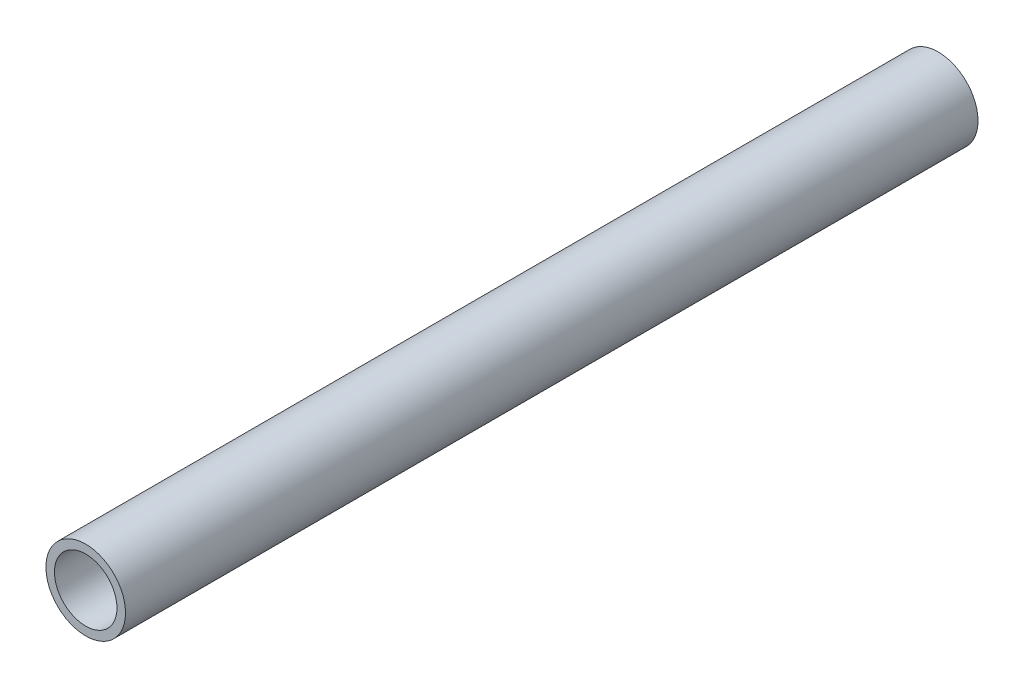
ISO-10303-21;
HEADER;
FILE_DESCRIPTION(('STEP AP214'),'2;1');
FILE_NAME('part.step','',(''),(''),'','','');
FILE_SCHEMA(('AUTOMOTIVE_DESIGN { 1 0 10303 214 1 1 1 1 }'));
ENDSEC;
DATA;
#1=APPLICATION_CONTEXT('core data for automotive mechanical design processes');
#2=APPLICATION_PROTOCOL_DEFINITION('international standard','automotive_design',2000,#1);
#3=PRODUCT_CONTEXT('',#1,'mechanical');
#4=PRODUCT('Part','Part','',(#3));
#5=PRODUCT_RELATED_PRODUCT_CATEGORY('part','',(#4));
#6=PRODUCT_DEFINITION_FORMATION('','',#4);
#7=PRODUCT_DEFINITION_CONTEXT('part definition',#1,'design');
#8=PRODUCT_DEFINITION('design','',#6,#7);
#9=PRODUCT_DEFINITION_SHAPE('','',#8);
#10=(LENGTH_UNIT() NAMED_UNIT(*) SI_UNIT(.MILLI.,.METRE.));
#11=(NAMED_UNIT(*) PLANE_ANGLE_UNIT() SI_UNIT($,.RADIAN.));
#12=(NAMED_UNIT(*) SI_UNIT($,.STERADIAN.) SOLID_ANGLE_UNIT());
#13=UNCERTAINTY_MEASURE_WITH_UNIT(LENGTH_MEASURE(1.E-05),#10,'distance_accuracy_value','');
#14=(GEOMETRIC_REPRESENTATION_CONTEXT(3) GLOBAL_UNCERTAINTY_ASSIGNED_CONTEXT((#13)) GLOBAL_UNIT_ASSIGNED_CONTEXT((#10,
#11,#12)) REPRESENTATION_CONTEXT('',''));
#15=CARTESIAN_POINT('',(0.,0.,0.));
#16=DIRECTION('',(0.,0.,1.));
#17=DIRECTION('',(1.,0.,0.));
#18=AXIS2_PLACEMENT_3D('',#15,#16,#17);
#19=CARTESIAN_POINT('',(0.,0.,150.));
#20=DIRECTION('',(0.,0.,-1.));
#21=DIRECTION('',(-1.,0.,0.));
#22=AXIS2_PLACEMENT_3D('',#19,#20,#21);
#23=CYLINDRICAL_SURFACE('',#22,7.);
#24=CARTESIAN_POINT('',(0.,0.,150.));
#25=DIRECTION('',(0.,0.,1.));
#26=DIRECTION('',(1.,0.,0.));
#27=AXIS2_PLACEMENT_3D('',#24,#25,#26);
#28=CIRCLE('',#27,7.);
#29=CARTESIAN_POINT('',(7.,0.,150.));
#30=VERTEX_POINT('',#29);
#31=EDGE_CURVE('E10',#30,#30,#28,.T.);
#32=ORIENTED_EDGE('',*,*,#31,.F.);
#33=EDGE_LOOP('',(#32));
#34=FACE_BOUND('',#33,.T.);
#35=CARTESIAN_POINT('',(0.,0.,0.));
#36=DIRECTION('',(0.,0.,1.));
#37=DIRECTION('',(1.,0.,0.));
#38=AXIS2_PLACEMENT_3D('',#35,#36,#37);
#39=CIRCLE('',#38,7.);
#40=CARTESIAN_POINT('',(7.,0.,0.));
#41=VERTEX_POINT('',#40);
#42=EDGE_CURVE('E40',#41,#41,#39,.T.);
#43=ORIENTED_EDGE('',*,*,#42,.T.);
#44=EDGE_LOOP('',(#43));
#45=FACE_BOUND('',#44,.T.);
#46=ADVANCED_FACE('F37',(#34,#45),#23,.T.);
#47=CARTESIAN_POINT('',(0.,0.,150.));
#48=DIRECTION('',(0.,0.,1.));
#49=DIRECTION('',(1.,0.,0.));
#50=AXIS2_PLACEMENT_3D('',#47,#48,#49);
#51=PLANE('',#50);
#52=CARTESIAN_POINT('',(0.,0.,150.));
#53=DIRECTION('',(0.,0.,1.));
#54=DIRECTION('',(1.,0.,0.));
#55=AXIS2_PLACEMENT_3D('',#52,#53,#54);
#56=CIRCLE('',#55,5.5);
#57=CARTESIAN_POINT('',(5.5,0.,150.));
#58=VERTEX_POINT('',#57);
#59=EDGE_CURVE('E49',#58,#58,#56,.T.);
#60=ORIENTED_EDGE('',*,*,#59,.F.);
#61=EDGE_LOOP('',(#60));
#62=FACE_BOUND('',#61,.T.);
#63=ORIENTED_EDGE('',*,*,#31,.T.);
#64=EDGE_LOOP('',(#63));
#65=FACE_BOUND('',#64,.T.);
#66=ADVANCED_FACE('F64',(#62,#65),#51,.T.);
#67=CARTESIAN_POINT('',(0.,0.,0.));
#68=DIRECTION('',(0.,0.,1.));
#69=DIRECTION('',(1.,0.,0.));
#70=AXIS2_PLACEMENT_3D('',#67,#68,#69);
#71=PLANE('',#70);
#72=CARTESIAN_POINT('',(0.,0.,0.));
#73=DIRECTION('',(0.,0.,1.));
#74=DIRECTION('',(1.,0.,0.));
#75=AXIS2_PLACEMENT_3D('',#72,#73,#74);
#76=CIRCLE('',#75,5.5);
#77=CARTESIAN_POINT('',(5.5,0.,0.));
#78=VERTEX_POINT('',#77);
#79=EDGE_CURVE('E47',#78,#78,#76,.T.);
#80=ORIENTED_EDGE('',*,*,#79,.T.);
#81=EDGE_LOOP('',(#80));
#82=FACE_BOUND('',#81,.T.);
#83=ORIENTED_EDGE('',*,*,#42,.F.);
#84=EDGE_LOOP('',(#83));
#85=FACE_BOUND('',#84,.T.);
#86=ADVANCED_FACE('F55',(#82,#85),#71,.F.);
#87=CARTESIAN_POINT('',(0.,0.,0.));
#88=DIRECTION('',(0.,0.,1.));
#89=DIRECTION('',(1.,0.,0.));
#90=AXIS2_PLACEMENT_3D('',#87,#88,#89);
#91=CYLINDRICAL_SURFACE('',#90,5.5);
#92=ORIENTED_EDGE('',*,*,#79,.F.);
#93=EDGE_LOOP('',(#92));
#94=FACE_BOUND('',#93,.T.);
#95=ORIENTED_EDGE('',*,*,#59,.T.);
#96=EDGE_LOOP('',(#95));
#97=FACE_BOUND('',#96,.T.);
#98=ADVANCED_FACE('F58',(#94,#97),#91,.F.);
#99=CLOSED_SHELL('',(#46,#66,#86,#98));
#100=MANIFOLD_SOLID_BREP('B2',#99);
#101=ADVANCED_BREP_SHAPE_REPRESENTATION('',(#18,#100),#14);
#102=SHAPE_DEFINITION_REPRESENTATION(#9,#101);
ENDSEC;
END-ISO-10303-21;
